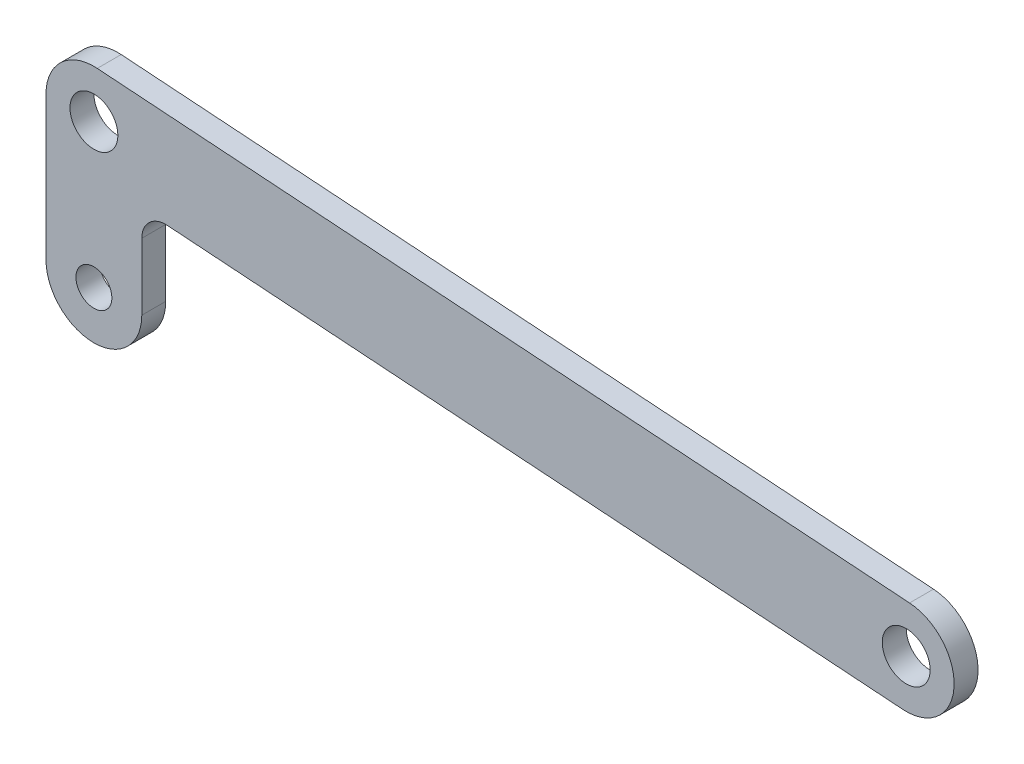
ISO-10303-21;
HEADER;
FILE_DESCRIPTION(('STEP AP214'),'2;1');
FILE_NAME('part.step','',(''),(''),'','','');
FILE_SCHEMA(('AUTOMOTIVE_DESIGN { 1 0 10303 214 1 1 1 1 }'));
ENDSEC;
DATA;
#1=APPLICATION_CONTEXT('core data for automotive mechanical design processes');
#2=APPLICATION_PROTOCOL_DEFINITION('international standard','automotive_design',2000,#1);
#3=PRODUCT_CONTEXT('',#1,'mechanical');
#4=PRODUCT('Part','Part','',(#3));
#5=PRODUCT_RELATED_PRODUCT_CATEGORY('part','',(#4));
#6=PRODUCT_DEFINITION_FORMATION('','',#4);
#7=PRODUCT_DEFINITION_CONTEXT('part definition',#1,'design');
#8=PRODUCT_DEFINITION('design','',#6,#7);
#9=PRODUCT_DEFINITION_SHAPE('','',#8);
#10=(LENGTH_UNIT() NAMED_UNIT(*) SI_UNIT(.MILLI.,.METRE.));
#11=(NAMED_UNIT(*) PLANE_ANGLE_UNIT() SI_UNIT($,.RADIAN.));
#12=(NAMED_UNIT(*) SI_UNIT($,.STERADIAN.) SOLID_ANGLE_UNIT());
#13=UNCERTAINTY_MEASURE_WITH_UNIT(LENGTH_MEASURE(1.E-05),#10,'distance_accuracy_value','');
#14=(GEOMETRIC_REPRESENTATION_CONTEXT(3) GLOBAL_UNCERTAINTY_ASSIGNED_CONTEXT((#13)) GLOBAL_UNIT_ASSIGNED_CONTEXT((#10,
#11,#12)) REPRESENTATION_CONTEXT('',''));
#15=CARTESIAN_POINT('',(0.,0.,0.));
#16=DIRECTION('',(0.,0.,1.));
#17=DIRECTION('',(1.,0.,0.));
#18=AXIS2_PLACEMENT_3D('',#15,#16,#17);
#19=CARTESIAN_POINT('',(30.,27.8289386992594,10.));
#20=DIRECTION('',(0.,0.,-1.));
#21=DIRECTION('',(-1.,0.,0.));
#22=AXIS2_PLACEMENT_3D('',#19,#20,#21);
#23=CYLINDRICAL_SURFACE('',#22,10.);
#24=CARTESIAN_POINT('',(30.,27.8289386992594,0.));
#25=DIRECTION('',(0.,0.,1.));
#26=DIRECTION('',(1.,0.,0.));
#27=AXIS2_PLACEMENT_3D('',#24,#25,#26);
#28=CIRCLE('',#27,10.);
#29=CARTESIAN_POINT('',(30.6975647374414,37.8045792018576,0.));
#30=VERTEX_POINT('',#29);
#31=CARTESIAN_POINT('',(20.,27.8289386992593,0.));
#32=VERTEX_POINT('',#31);
#33=EDGE_CURVE('E143',#30,#32,#28,.T.);
#34=ORIENTED_EDGE('',*,*,#33,.F.);
#35=DIRECTION('',(0.,0.,-1.));
#36=VECTOR('',#35,1.);
#37=CARTESIAN_POINT('',(30.6975647374414,37.8045792018576,10.));
#38=LINE('',#37,#36);
#39=CARTESIAN_POINT('',(30.6975647374414,37.8045792018576,10.));
#40=VERTEX_POINT('',#39);
#41=EDGE_CURVE('E11',#40,#30,#38,.T.);
#42=ORIENTED_EDGE('',*,*,#41,.F.);
#43=CARTESIAN_POINT('',(30.,27.8289386992594,10.));
#44=DIRECTION('',(0.,0.,1.));
#45=DIRECTION('',(1.,0.,0.));
#46=AXIS2_PLACEMENT_3D('',#43,#44,#45);
#47=CIRCLE('',#46,10.);
#48=CARTESIAN_POINT('',(20.,27.8289386992593,10.));
#49=VERTEX_POINT('',#48);
#50=EDGE_CURVE('E228',#40,#49,#47,.T.);
#51=ORIENTED_EDGE('',*,*,#50,.T.);
#52=DIRECTION('',(0.,0.,-1.));
#53=VECTOR('',#52,1.);
#54=CARTESIAN_POINT('',(20.,27.8289386992593,10.));
#55=LINE('',#54,#53);
#56=EDGE_CURVE('E86',#49,#32,#55,.T.);
#57=ORIENTED_EDGE('',*,*,#56,.T.);
#58=EDGE_LOOP('',(#34,#42,#51,#57));
#59=FACE_BOUND('',#58,.T.);
#60=ADVANCED_FACE('F34',(#59),#23,.F.);
#61=CARTESIAN_POINT('',(2.7800635539196,39.7567610570506,10.));
#62=DIRECTION('',(0.0697564737441289,0.997564050259824,0.));
#63=DIRECTION('',(-0.997564050259824,0.0697564737441289,0.));
#64=AXIS2_PLACEMENT_3D('',#61,#62,#63);
#65=PLANE('',#64);
#66=DIRECTION('',(0.997564050259824,-0.0697564737441289,0.));
#67=VECTOR('',#66,1.);
#68=CARTESIAN_POINT('',(2.7800635539196,39.7567610570506,0.));
#69=LINE('',#68,#67);
#70=CARTESIAN_POINT('',(337.776647613457,16.3315179217997,0.));
#71=VERTEX_POINT('',#70);
#72=EDGE_CURVE('E145',#30,#71,#69,.T.);
#73=ORIENTED_EDGE('',*,*,#72,.T.);
#74=DIRECTION('',(0.,0.,-1.));
#75=VECTOR('',#74,1.);
#76=CARTESIAN_POINT('',(337.776647613457,16.3315179217997,10.));
#77=LINE('',#76,#75);
#78=CARTESIAN_POINT('',(337.776647613457,16.3315179217997,10.));
#79=VERTEX_POINT('',#78);
#80=EDGE_CURVE('E43',#79,#71,#77,.T.);
#81=ORIENTED_EDGE('',*,*,#80,.F.);
#82=DIRECTION('',(0.997564050259824,-0.0697564737441289,0.));
#83=VECTOR('',#82,1.);
#84=CARTESIAN_POINT('',(2.7800635539196,39.7567610570506,10.));
#85=LINE('',#84,#83);
#86=EDGE_CURVE('E230',#40,#79,#85,.T.);
#87=ORIENTED_EDGE('',*,*,#86,.F.);
#88=ORIENTED_EDGE('',*,*,#41,.T.);
#89=EDGE_LOOP('',(#73,#81,#87,#88));
#90=FACE_BOUND('',#89,.T.);
#91=ADVANCED_FACE('F183',(#90),#65,.F.);
#92=CARTESIAN_POINT('',(339.17177708834,36.2827989269962,10.));
#93=DIRECTION('',(0.,0.,-1.));
#94=DIRECTION('',(-1.,0.,0.));
#95=AXIS2_PLACEMENT_3D('',#92,#93,#94);
#96=CYLINDRICAL_SURFACE('',#95,20.);
#97=CARTESIAN_POINT('',(339.17177708834,36.2827989269962,0.));
#98=DIRECTION('',(0.,0.,1.));
#99=DIRECTION('',(1.,0.,0.));
#100=AXIS2_PLACEMENT_3D('',#97,#98,#99);
#101=CIRCLE('',#100,20.);
#102=CARTESIAN_POINT('',(340.566906563223,56.2340799321927,0.));
#103=VERTEX_POINT('',#102);
#104=EDGE_CURVE('E148',#71,#103,#101,.T.);
#105=ORIENTED_EDGE('',*,*,#104,.T.);
#106=DIRECTION('',(0.,0.,-1.));
#107=VECTOR('',#106,1.);
#108=CARTESIAN_POINT('',(340.566906563223,56.2340799321927,10.));
#109=LINE('',#108,#107);
#110=CARTESIAN_POINT('',(340.566906563223,56.2340799321927,10.));
#111=VERTEX_POINT('',#110);
#112=EDGE_CURVE('E173',#111,#103,#109,.T.);
#113=ORIENTED_EDGE('',*,*,#112,.F.);
#114=CARTESIAN_POINT('',(339.17177708834,36.2827989269962,10.));
#115=DIRECTION('',(0.,0.,1.));
#116=DIRECTION('',(1.,0.,0.));
#117=AXIS2_PLACEMENT_3D('',#114,#115,#116);
#118=CIRCLE('',#117,20.);
#119=EDGE_CURVE('E179',#79,#111,#118,.T.);
#120=ORIENTED_EDGE('',*,*,#119,.F.);
#121=ORIENTED_EDGE('',*,*,#80,.T.);
#122=EDGE_LOOP('',(#105,#113,#120,#121));
#123=FACE_BOUND('',#122,.T.);
#124=ADVANCED_FACE('F177',(#123),#96,.T.);
#125=CARTESIAN_POINT('',(5.57032250368475,79.6593230674435,10.));
#126=DIRECTION('',(0.0697564737441288,0.997564050259824,0.));
#127=DIRECTION('',(-0.997564050259824,0.0697564737441288,0.));
#128=AXIS2_PLACEMENT_3D('',#125,#126,#127);
#129=PLANE('',#128);
#130=DIRECTION('',(0.997564050259824,-0.0697564737441288,0.));
#131=VECTOR('',#130,1.);
#132=CARTESIAN_POINT('',(5.57032250368475,79.6593230674435,0.));
#133=LINE('',#132,#131);
#134=CARTESIAN_POINT('',(1.39512947488258,79.9512810051965,0.));
#135=VERTEX_POINT('',#134);
#136=EDGE_CURVE('E151',#135,#103,#133,.T.);
#137=ORIENTED_EDGE('',*,*,#136,.F.);
#138=DIRECTION('',(0.,0.,-1.));
#139=VECTOR('',#138,1.);
#140=CARTESIAN_POINT('',(1.39512947488258,79.9512810051965,10.));
#141=LINE('',#140,#139);
#142=CARTESIAN_POINT('',(1.39512947488258,79.9512810051965,10.));
#143=VERTEX_POINT('',#142);
#144=EDGE_CURVE('E171',#143,#135,#141,.T.);
#145=ORIENTED_EDGE('',*,*,#144,.F.);
#146=DIRECTION('',(0.997564050259824,-0.0697564737441288,0.));
#147=VECTOR('',#146,1.);
#148=CARTESIAN_POINT('',(5.57032250368475,79.6593230674435,10.));
#149=LINE('',#148,#147);
#150=EDGE_CURVE('E129',#143,#111,#149,.T.);
#151=ORIENTED_EDGE('',*,*,#150,.T.);
#152=ORIENTED_EDGE('',*,*,#112,.T.);
#153=EDGE_LOOP('',(#137,#145,#151,#152));
#154=FACE_BOUND('',#153,.T.);
#155=ADVANCED_FACE('F194',(#154),#129,.T.);
#156=CARTESIAN_POINT('',(0.,60.,10.));
#157=DIRECTION('',(0.,0.,-1.));
#158=DIRECTION('',(-1.,0.,0.));
#159=AXIS2_PLACEMENT_3D('',#156,#157,#158);
#160=CYLINDRICAL_SURFACE('',#159,20.);
#161=CARTESIAN_POINT('',(0.,60.,0.));
#162=DIRECTION('',(0.,0.,1.));
#163=DIRECTION('',(1.,0.,0.));
#164=AXIS2_PLACEMENT_3D('',#161,#162,#163);
#165=CIRCLE('',#164,20.);
#166=CARTESIAN_POINT('',(-20.,60.,0.));
#167=VERTEX_POINT('',#166);
#168=EDGE_CURVE('E154',#135,#167,#165,.T.);
#169=ORIENTED_EDGE('',*,*,#168,.T.);
#170=DIRECTION('',(0.,0.,-1.));
#171=VECTOR('',#170,1.);
#172=CARTESIAN_POINT('',(-20.,60.,10.));
#173=LINE('',#172,#171);
#174=CARTESIAN_POINT('',(-20.,60.,10.));
#175=VERTEX_POINT('',#174);
#176=EDGE_CURVE('E115',#175,#167,#173,.T.);
#177=ORIENTED_EDGE('',*,*,#176,.F.);
#178=CARTESIAN_POINT('',(0.,60.,10.));
#179=DIRECTION('',(0.,0.,1.));
#180=DIRECTION('',(1.,0.,0.));
#181=AXIS2_PLACEMENT_3D('',#178,#179,#180);
#182=CIRCLE('',#181,20.);
#183=EDGE_CURVE('E126',#143,#175,#182,.T.);
#184=ORIENTED_EDGE('',*,*,#183,.F.);
#185=ORIENTED_EDGE('',*,*,#144,.T.);
#186=EDGE_LOOP('',(#169,#177,#184,#185));
#187=FACE_BOUND('',#186,.T.);
#188=ADVANCED_FACE('F197',(#187),#160,.T.);
#189=CARTESIAN_POINT('',(-20.,0.,10.));
#190=DIRECTION('',(-1.,0.,0.));
#191=DIRECTION('',(0.,0.,1.));
#192=AXIS2_PLACEMENT_3D('',#189,#190,#191);
#193=PLANE('',#192);
#194=DIRECTION('',(0.,1.,0.));
#195=VECTOR('',#194,1.);
#196=CARTESIAN_POINT('',(-20.,0.,0.));
#197=LINE('',#196,#195);
#198=CARTESIAN_POINT('',(-20.,0.,0.));
#199=VERTEX_POINT('',#198);
#200=EDGE_CURVE('E112',#199,#167,#197,.T.);
#201=ORIENTED_EDGE('',*,*,#200,.F.);
#202=DIRECTION('',(0.,0.,-1.));
#203=VECTOR('',#202,1.);
#204=CARTESIAN_POINT('',(-20.,0.,10.));
#205=LINE('',#204,#203);
#206=CARTESIAN_POINT('',(-20.,0.,10.));
#207=VERTEX_POINT('',#206);
#208=EDGE_CURVE('E106',#207,#199,#205,.T.);
#209=ORIENTED_EDGE('',*,*,#208,.F.);
#210=DIRECTION('',(0.,1.,0.));
#211=VECTOR('',#210,1.);
#212=CARTESIAN_POINT('',(-20.,0.,10.));
#213=LINE('',#212,#211);
#214=EDGE_CURVE('E110',#207,#175,#213,.T.);
#215=ORIENTED_EDGE('',*,*,#214,.T.);
#216=ORIENTED_EDGE('',*,*,#176,.T.);
#217=EDGE_LOOP('',(#201,#209,#215,#216));
#218=FACE_BOUND('',#217,.T.);
#219=ADVANCED_FACE('F108',(#218),#193,.T.);
#220=CARTESIAN_POINT('',(0.,0.,10.));
#221=DIRECTION('',(0.,0.,-1.));
#222=DIRECTION('',(-1.,0.,0.));
#223=AXIS2_PLACEMENT_3D('',#220,#221,#222);
#224=CYLINDRICAL_SURFACE('',#223,20.);
#225=CARTESIAN_POINT('',(0.,0.,0.));
#226=DIRECTION('',(0.,0.,1.));
#227=DIRECTION('',(1.,0.,0.));
#228=AXIS2_PLACEMENT_3D('',#225,#226,#227);
#229=CIRCLE('',#228,20.);
#230=CARTESIAN_POINT('',(20.,0.,0.));
#231=VERTEX_POINT('',#230);
#232=EDGE_CURVE('E158',#199,#231,#229,.T.);
#233=ORIENTED_EDGE('',*,*,#232,.T.);
#234=DIRECTION('',(0.,0.,-1.));
#235=VECTOR('',#234,1.);
#236=CARTESIAN_POINT('',(20.,0.,10.));
#237=LINE('',#236,#235);
#238=CARTESIAN_POINT('',(20.,0.,10.));
#239=VERTEX_POINT('',#238);
#240=EDGE_CURVE('E116',#239,#231,#237,.T.);
#241=ORIENTED_EDGE('',*,*,#240,.F.);
#242=CARTESIAN_POINT('',(0.,0.,10.));
#243=DIRECTION('',(0.,0.,1.));
#244=DIRECTION('',(1.,0.,0.));
#245=AXIS2_PLACEMENT_3D('',#242,#243,#244);
#246=CIRCLE('',#245,20.);
#247=EDGE_CURVE('E119',#207,#239,#246,.T.);
#248=ORIENTED_EDGE('',*,*,#247,.F.);
#249=ORIENTED_EDGE('',*,*,#208,.T.);
#250=EDGE_LOOP('',(#233,#241,#248,#249));
#251=FACE_BOUND('',#250,.T.);
#252=ADVANCED_FACE('F120',(#251),#224,.T.);
#253=CARTESIAN_POINT('',(339.17177708834,36.2827989269962,10.));
#254=DIRECTION('',(0.,0.,-1.));
#255=DIRECTION('',(-1.,0.,0.));
#256=AXIS2_PLACEMENT_3D('',#253,#254,#255);
#257=CYLINDRICAL_SURFACE('',#256,9.99999999999998);
#258=CARTESIAN_POINT('',(339.17177708834,36.2827989269962,10.));
#259=DIRECTION('',(0.,0.,1.));
#260=DIRECTION('',(1.,0.,0.));
#261=AXIS2_PLACEMENT_3D('',#258,#259,#260);
#262=CIRCLE('',#261,9.99999999999998);
#263=CARTESIAN_POINT('',(349.17177708834,36.2827989269962,10.));
#264=VERTEX_POINT('',#263);
#265=EDGE_CURVE('E134',#264,#264,#262,.T.);
#266=ORIENTED_EDGE('',*,*,#265,.T.);
#267=EDGE_LOOP('',(#266));
#268=FACE_BOUND('',#267,.T.);
#269=CARTESIAN_POINT('',(339.17177708834,36.2827989269962,0.));
#270=DIRECTION('',(0.,0.,1.));
#271=DIRECTION('',(1.,0.,0.));
#272=AXIS2_PLACEMENT_3D('',#269,#270,#271);
#273=CIRCLE('',#272,9.99999999999998);
#274=CARTESIAN_POINT('',(349.17177708834,36.2827989269962,0.));
#275=VERTEX_POINT('',#274);
#276=EDGE_CURVE('E161',#275,#275,#273,.T.);
#277=ORIENTED_EDGE('',*,*,#276,.F.);
#278=EDGE_LOOP('',(#277));
#279=FACE_BOUND('',#278,.T.);
#280=ADVANCED_FACE('F206',(#268,#279),#257,.F.);
#281=CARTESIAN_POINT('',(20.,0.,10.));
#282=DIRECTION('',(-1.,0.,0.));
#283=DIRECTION('',(0.,-1.,0.));
#284=AXIS2_PLACEMENT_3D('',#281,#282,#283);
#285=PLANE('',#284);
#286=DIRECTION('',(0.,1.,0.));
#287=VECTOR('',#286,1.);
#288=CARTESIAN_POINT('',(20.,0.,0.));
#289=LINE('',#288,#287);
#290=EDGE_CURVE('E79',#231,#32,#289,.T.);
#291=ORIENTED_EDGE('',*,*,#290,.T.);
#292=ORIENTED_EDGE('',*,*,#56,.F.);
#293=DIRECTION('',(0.,1.,0.));
#294=VECTOR('',#293,1.);
#295=CARTESIAN_POINT('',(20.,0.,10.));
#296=LINE('',#295,#294);
#297=EDGE_CURVE('E51',#239,#49,#296,.T.);
#298=ORIENTED_EDGE('',*,*,#297,.F.);
#299=ORIENTED_EDGE('',*,*,#240,.T.);
#300=EDGE_LOOP('',(#291,#292,#298,#299));
#301=FACE_BOUND('',#300,.T.);
#302=ADVANCED_FACE('F207',(#301),#285,.F.);
#303=CARTESIAN_POINT('',(0.,60.,10.));
#304=DIRECTION('',(0.,0.,-1.));
#305=DIRECTION('',(-1.,0.,0.));
#306=AXIS2_PLACEMENT_3D('',#303,#304,#305);
#307=CYLINDRICAL_SURFACE('',#306,10.);
#308=CARTESIAN_POINT('',(0.,60.,10.));
#309=DIRECTION('',(0.,0.,1.));
#310=DIRECTION('',(1.,0.,0.));
#311=AXIS2_PLACEMENT_3D('',#308,#309,#310);
#312=CIRCLE('',#311,10.);
#313=CARTESIAN_POINT('',(10.,60.,10.));
#314=VERTEX_POINT('',#313);
#315=EDGE_CURVE('E167',#314,#314,#312,.T.);
#316=ORIENTED_EDGE('',*,*,#315,.T.);
#317=EDGE_LOOP('',(#316));
#318=FACE_BOUND('',#317,.T.);
#319=CARTESIAN_POINT('',(0.,60.,0.));
#320=DIRECTION('',(0.,0.,1.));
#321=DIRECTION('',(1.,0.,0.));
#322=AXIS2_PLACEMENT_3D('',#319,#320,#321);
#323=CIRCLE('',#322,10.);
#324=CARTESIAN_POINT('',(10.,60.,0.));
#325=VERTEX_POINT('',#324);
#326=EDGE_CURVE('E140',#325,#325,#323,.T.);
#327=ORIENTED_EDGE('',*,*,#326,.F.);
#328=EDGE_LOOP('',(#327));
#329=FACE_BOUND('',#328,.T.);
#330=ADVANCED_FACE('F36',(#318,#329),#307,.F.);
#331=CARTESIAN_POINT('',(0.,0.,10.));
#332=DIRECTION('',(0.,0.,-1.));
#333=DIRECTION('',(-1.,0.,0.));
#334=AXIS2_PLACEMENT_3D('',#331,#332,#333);
#335=CYLINDRICAL_SURFACE('',#334,7.5);
#336=CARTESIAN_POINT('',(0.,0.,10.));
#337=DIRECTION('',(0.,0.,1.));
#338=DIRECTION('',(1.,0.,0.));
#339=AXIS2_PLACEMENT_3D('',#336,#337,#338);
#340=CIRCLE('',#339,7.5);
#341=CARTESIAN_POINT('',(7.5,0.,10.));
#342=VERTEX_POINT('',#341);
#343=EDGE_CURVE('E137',#342,#342,#340,.T.);
#344=ORIENTED_EDGE('',*,*,#343,.T.);
#345=EDGE_LOOP('',(#344));
#346=FACE_BOUND('',#345,.T.);
#347=CARTESIAN_POINT('',(0.,0.,0.));
#348=DIRECTION('',(0.,0.,1.));
#349=DIRECTION('',(1.,0.,0.));
#350=AXIS2_PLACEMENT_3D('',#347,#348,#349);
#351=CIRCLE('',#350,7.5);
#352=CARTESIAN_POINT('',(7.5,0.,0.));
#353=VERTEX_POINT('',#352);
#354=EDGE_CURVE('E164',#353,#353,#351,.T.);
#355=ORIENTED_EDGE('',*,*,#354,.F.);
#356=EDGE_LOOP('',(#355));
#357=FACE_BOUND('',#356,.T.);
#358=ADVANCED_FACE('F214',(#346,#357),#335,.F.);
#359=CARTESIAN_POINT('',(0.,0.,10.));
#360=DIRECTION('',(0.,0.,1.));
#361=DIRECTION('',(1.,0.,0.));
#362=AXIS2_PLACEMENT_3D('',#359,#360,#361);
#363=PLANE('',#362);
#364=ORIENTED_EDGE('',*,*,#315,.F.);
#365=EDGE_LOOP('',(#364));
#366=FACE_BOUND('',#365,.T.);
#367=ORIENTED_EDGE('',*,*,#50,.F.);
#368=ORIENTED_EDGE('',*,*,#86,.T.);
#369=ORIENTED_EDGE('',*,*,#119,.T.);
#370=ORIENTED_EDGE('',*,*,#150,.F.);
#371=ORIENTED_EDGE('',*,*,#183,.T.);
#372=ORIENTED_EDGE('',*,*,#214,.F.);
#373=ORIENTED_EDGE('',*,*,#247,.T.);
#374=ORIENTED_EDGE('',*,*,#297,.T.);
#375=EDGE_LOOP('',(#367,#368,#369,#370,#371,#372,#373,#374));
#376=FACE_BOUND('',#375,.T.);
#377=ORIENTED_EDGE('',*,*,#265,.F.);
#378=EDGE_LOOP('',(#377));
#379=FACE_BOUND('',#378,.T.);
#380=ORIENTED_EDGE('',*,*,#343,.F.);
#381=EDGE_LOOP('',(#380));
#382=FACE_BOUND('',#381,.T.);
#383=ADVANCED_FACE('F122',(#366,#376,#379,#382),#363,.T.);
#384=CARTESIAN_POINT('',(0.,0.,0.));
#385=DIRECTION('',(0.,0.,1.));
#386=DIRECTION('',(1.,0.,0.));
#387=AXIS2_PLACEMENT_3D('',#384,#385,#386);
#388=PLANE('',#387);
#389=ORIENTED_EDGE('',*,*,#326,.T.);
#390=EDGE_LOOP('',(#389));
#391=FACE_BOUND('',#390,.T.);
#392=ORIENTED_EDGE('',*,*,#33,.T.);
#393=ORIENTED_EDGE('',*,*,#290,.F.);
#394=ORIENTED_EDGE('',*,*,#232,.F.);
#395=ORIENTED_EDGE('',*,*,#200,.T.);
#396=ORIENTED_EDGE('',*,*,#168,.F.);
#397=ORIENTED_EDGE('',*,*,#136,.T.);
#398=ORIENTED_EDGE('',*,*,#104,.F.);
#399=ORIENTED_EDGE('',*,*,#72,.F.);
#400=EDGE_LOOP('',(#392,#393,#394,#395,#396,#397,#398,#399));
#401=FACE_BOUND('',#400,.T.);
#402=ORIENTED_EDGE('',*,*,#276,.T.);
#403=EDGE_LOOP('',(#402));
#404=FACE_BOUND('',#403,.T.);
#405=ORIENTED_EDGE('',*,*,#354,.T.);
#406=EDGE_LOOP('',(#405));
#407=FACE_BOUND('',#406,.T.);
#408=ADVANCED_FACE('F184',(#391,#401,#404,#407),#388,.F.);
#409=CLOSED_SHELL('',(#60,#91,#124,#155,#188,#219,#252,#280,#302,#330,#358,#383,#408));
#410=MANIFOLD_SOLID_BREP('B2',#409);
#411=ADVANCED_BREP_SHAPE_REPRESENTATION('',(#18,#410),#14);
#412=SHAPE_DEFINITION_REPRESENTATION(#9,#411);
ENDSEC;
END-ISO-10303-21;
